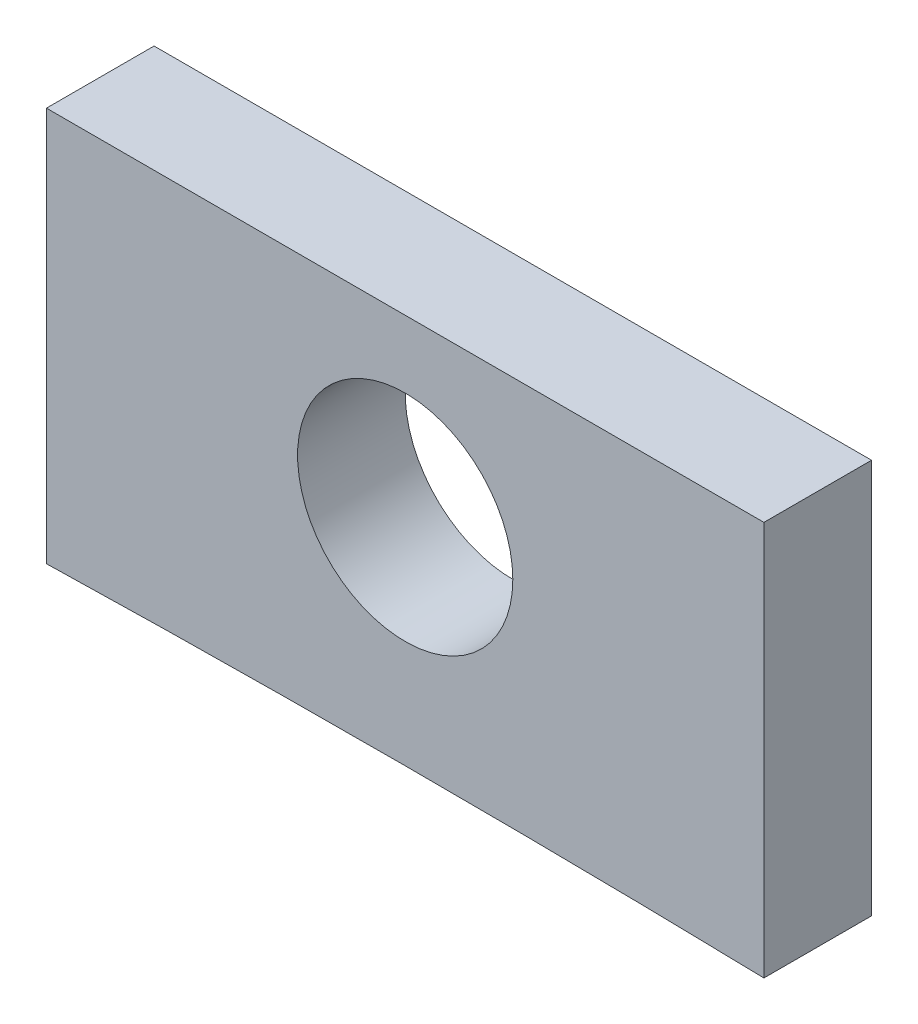
ISO-10303-21;
HEADER;
FILE_DESCRIPTION(('STEP AP214'),'2;1');
FILE_NAME('part.step','',(''),(''),'','','');
FILE_SCHEMA(('AUTOMOTIVE_DESIGN { 1 0 10303 214 1 1 1 1 }'));
ENDSEC;
DATA;
#1=APPLICATION_CONTEXT('core data for automotive mechanical design processes');
#2=APPLICATION_PROTOCOL_DEFINITION('international standard','automotive_design',2000,#1);
#3=PRODUCT_CONTEXT('',#1,'mechanical');
#4=PRODUCT('Part','Part','',(#3));
#5=PRODUCT_RELATED_PRODUCT_CATEGORY('part','',(#4));
#6=PRODUCT_DEFINITION_FORMATION('','',#4);
#7=PRODUCT_DEFINITION_CONTEXT('part definition',#1,'design');
#8=PRODUCT_DEFINITION('design','',#6,#7);
#9=PRODUCT_DEFINITION_SHAPE('','',#8);
#10=(LENGTH_UNIT() NAMED_UNIT(*) SI_UNIT(.MILLI.,.METRE.));
#11=(NAMED_UNIT(*) PLANE_ANGLE_UNIT() SI_UNIT($,.RADIAN.));
#12=(NAMED_UNIT(*) SI_UNIT($,.STERADIAN.) SOLID_ANGLE_UNIT());
#13=UNCERTAINTY_MEASURE_WITH_UNIT(LENGTH_MEASURE(1.E-05),#10,'distance_accuracy_value','');
#14=(GEOMETRIC_REPRESENTATION_CONTEXT(3) GLOBAL_UNCERTAINTY_ASSIGNED_CONTEXT((#13)) GLOBAL_UNIT_ASSIGNED_CONTEXT((#10,
#11,#12)) REPRESENTATION_CONTEXT('',''));
#15=CARTESIAN_POINT('',(0.,0.,0.));
#16=DIRECTION('',(0.,0.,1.));
#17=DIRECTION('',(1.,0.,0.));
#18=AXIS2_PLACEMENT_3D('',#15,#16,#17);
#19=CARTESIAN_POINT('',(0.,283.,3.));
#20=DIRECTION('',(0.,0.,-1.));
#21=DIRECTION('',(-1.,0.,0.));
#22=AXIS2_PLACEMENT_3D('',#19,#20,#21);
#23=PLANE('',#22);
#24=DIRECTION('',(0.,-1.,0.));
#25=VECTOR('',#24,1.);
#26=CARTESIAN_POINT('',(-10.,699.876828606906,3.));
#27=LINE('',#26,#25);
#28=CARTESIAN_POINT('',(-10.,699.876828606906,3.));
#29=VERTEX_POINT('',#28);
#30=CARTESIAN_POINT('',(-10.,688.876828606906,3.));
#31=VERTEX_POINT('',#30);
#32=EDGE_CURVE('E85',#29,#31,#27,.T.);
#33=ORIENTED_EDGE('',*,*,#32,.T.);
#34=CARTESIAN_POINT('',(0.,283.,3.));
#35=DIRECTION('',(0.,0.,-1.));
#36=DIRECTION('',(-1.,0.,0.));
#37=AXIS2_PLACEMENT_3D('',#34,#35,#36);
#38=CIRCLE('',#37,406.);
#39=CARTESIAN_POINT('',(10.,688.876828606906,3.));
#40=VERTEX_POINT('',#39);
#41=EDGE_CURVE('E80',#31,#40,#38,.T.);
#42=ORIENTED_EDGE('',*,*,#41,.T.);
#43=DIRECTION('',(0.,1.,0.));
#44=VECTOR('',#43,1.);
#45=CARTESIAN_POINT('',(10.,699.876828606906,3.));
#46=LINE('',#45,#44);
#47=CARTESIAN_POINT('',(10.,699.876828606906,3.));
#48=VERTEX_POINT('',#47);
#49=EDGE_CURVE('E83',#40,#48,#46,.T.);
#50=ORIENTED_EDGE('',*,*,#49,.T.);
#51=DIRECTION('',(-1.,0.,0.));
#52=VECTOR('',#51,1.);
#53=CARTESIAN_POINT('',(-10.,699.876828606906,3.));
#54=LINE('',#53,#52);
#55=EDGE_CURVE('E50',#48,#29,#54,.T.);
#56=ORIENTED_EDGE('',*,*,#55,.T.);
#57=EDGE_LOOP('',(#33,#42,#50,#56));
#58=FACE_BOUND('',#57,.T.);
#59=CARTESIAN_POINT('',(0.,695.,3.));
#60=DIRECTION('',(0.,0.,1.));
#61=DIRECTION('',(1.,0.,0.));
#62=AXIS2_PLACEMENT_3D('',#59,#60,#61);
#63=CIRCLE('',#62,3.);
#64=CARTESIAN_POINT('',(3.,695.,3.));
#65=VERTEX_POINT('',#64);
#66=EDGE_CURVE('E100',#65,#65,#63,.T.);
#67=ORIENTED_EDGE('',*,*,#66,.F.);
#68=EDGE_LOOP('',(#67));
#69=FACE_BOUND('',#68,.T.);
#70=ADVANCED_FACE('F33',(#58,#69),#23,.F.);
#71=CARTESIAN_POINT('',(0.,283.,0.));
#72=DIRECTION('',(0.,0.,-1.));
#73=DIRECTION('',(-1.,0.,0.));
#74=AXIS2_PLACEMENT_3D('',#71,#72,#73);
#75=PLANE('',#74);
#76=DIRECTION('',(0.,-1.,0.));
#77=VECTOR('',#76,1.);
#78=CARTESIAN_POINT('',(-10.,699.876828606906,0.));
#79=LINE('',#78,#77);
#80=CARTESIAN_POINT('',(-10.,699.876828606906,0.));
#81=VERTEX_POINT('',#80);
#82=CARTESIAN_POINT('',(-10.,688.876828606906,0.));
#83=VERTEX_POINT('',#82);
#84=EDGE_CURVE('E97',#81,#83,#79,.T.);
#85=ORIENTED_EDGE('',*,*,#84,.F.);
#86=DIRECTION('',(-1.,0.,0.));
#87=VECTOR('',#86,1.);
#88=CARTESIAN_POINT('',(-10.,699.876828606906,0.));
#89=LINE('',#88,#87);
#90=CARTESIAN_POINT('',(10.,699.876828606906,0.));
#91=VERTEX_POINT('',#90);
#92=EDGE_CURVE('E73',#91,#81,#89,.T.);
#93=ORIENTED_EDGE('',*,*,#92,.F.);
#94=DIRECTION('',(0.,1.,0.));
#95=VECTOR('',#94,1.);
#96=CARTESIAN_POINT('',(10.,699.876828606906,0.));
#97=LINE('',#96,#95);
#98=CARTESIAN_POINT('',(10.,688.876828606906,0.));
#99=VERTEX_POINT('',#98);
#100=EDGE_CURVE('E67',#99,#91,#97,.T.);
#101=ORIENTED_EDGE('',*,*,#100,.F.);
#102=CARTESIAN_POINT('',(0.,283.,0.));
#103=DIRECTION('',(0.,0.,-1.));
#104=DIRECTION('',(-1.,0.,0.));
#105=AXIS2_PLACEMENT_3D('',#102,#103,#104);
#106=CIRCLE('',#105,406.);
#107=EDGE_CURVE('E89',#83,#99,#106,.T.);
#108=ORIENTED_EDGE('',*,*,#107,.F.);
#109=EDGE_LOOP('',(#85,#93,#101,#108));
#110=FACE_BOUND('',#109,.T.);
#111=CARTESIAN_POINT('',(0.,695.,0.));
#112=DIRECTION('',(0.,0.,1.));
#113=DIRECTION('',(1.,0.,0.));
#114=AXIS2_PLACEMENT_3D('',#111,#112,#113);
#115=CIRCLE('',#114,3.);
#116=CARTESIAN_POINT('',(3.,695.,0.));
#117=VERTEX_POINT('',#116);
#118=EDGE_CURVE('E112',#117,#117,#115,.T.);
#119=ORIENTED_EDGE('',*,*,#118,.T.);
#120=EDGE_LOOP('',(#119));
#121=FACE_BOUND('',#120,.T.);
#122=ADVANCED_FACE('F108',(#110,#121),#75,.T.);
#123=CARTESIAN_POINT('',(-10.,699.876828606906,3.));
#124=DIRECTION('',(1.,0.,0.));
#125=DIRECTION('',(0.,1.,0.));
#126=AXIS2_PLACEMENT_3D('',#123,#124,#125);
#127=PLANE('',#126);
#128=ORIENTED_EDGE('',*,*,#84,.T.);
#129=DIRECTION('',(0.,0.,-1.));
#130=VECTOR('',#129,1.);
#131=CARTESIAN_POINT('',(-10.,688.876828606906,3.));
#132=LINE('',#131,#130);
#133=EDGE_CURVE('E11',#31,#83,#132,.T.);
#134=ORIENTED_EDGE('',*,*,#133,.F.);
#135=ORIENTED_EDGE('',*,*,#32,.F.);
#136=DIRECTION('',(0.,0.,-1.));
#137=VECTOR('',#136,1.);
#138=CARTESIAN_POINT('',(-10.,699.876828606906,3.));
#139=LINE('',#138,#137);
#140=EDGE_CURVE('E93',#29,#81,#139,.T.);
#141=ORIENTED_EDGE('',*,*,#140,.T.);
#142=EDGE_LOOP('',(#128,#134,#135,#141));
#143=FACE_BOUND('',#142,.T.);
#144=ADVANCED_FACE('F35',(#143),#127,.F.);
#145=CARTESIAN_POINT('',(0.,283.,3.));
#146=DIRECTION('',(0.,0.,-1.));
#147=DIRECTION('',(-1.,0.,0.));
#148=AXIS2_PLACEMENT_3D('',#145,#146,#147);
#149=CYLINDRICAL_SURFACE('',#148,406.);
#150=ORIENTED_EDGE('',*,*,#107,.T.);
#151=DIRECTION('',(0.,0.,-1.));
#152=VECTOR('',#151,1.);
#153=CARTESIAN_POINT('',(10.,688.876828606906,3.));
#154=LINE('',#153,#152);
#155=EDGE_CURVE('E42',#40,#99,#154,.T.);
#156=ORIENTED_EDGE('',*,*,#155,.F.);
#157=ORIENTED_EDGE('',*,*,#41,.F.);
#158=ORIENTED_EDGE('',*,*,#133,.T.);
#159=EDGE_LOOP('',(#150,#156,#157,#158));
#160=FACE_BOUND('',#159,.T.);
#161=ADVANCED_FACE('F88',(#160),#149,.F.);
#162=CARTESIAN_POINT('',(10.,699.876828606906,3.));
#163=DIRECTION('',(-1.,0.,0.));
#164=DIRECTION('',(0.,-1.,0.));
#165=AXIS2_PLACEMENT_3D('',#162,#163,#164);
#166=PLANE('',#165);
#167=ORIENTED_EDGE('',*,*,#100,.T.);
#168=DIRECTION('',(0.,0.,-1.));
#169=VECTOR('',#168,1.);
#170=CARTESIAN_POINT('',(10.,699.876828606906,3.));
#171=LINE('',#170,#169);
#172=EDGE_CURVE('E90',#48,#91,#171,.T.);
#173=ORIENTED_EDGE('',*,*,#172,.F.);
#174=ORIENTED_EDGE('',*,*,#49,.F.);
#175=ORIENTED_EDGE('',*,*,#155,.T.);
#176=EDGE_LOOP('',(#167,#173,#174,#175));
#177=FACE_BOUND('',#176,.T.);
#178=ADVANCED_FACE('F91',(#177),#166,.F.);
#179=CARTESIAN_POINT('',(-10.,699.876828606906,3.));
#180=DIRECTION('',(0.,-1.,0.));
#181=DIRECTION('',(0.,0.,-1.));
#182=AXIS2_PLACEMENT_3D('',#179,#180,#181);
#183=PLANE('',#182);
#184=ORIENTED_EDGE('',*,*,#92,.T.);
#185=ORIENTED_EDGE('',*,*,#140,.F.);
#186=ORIENTED_EDGE('',*,*,#55,.F.);
#187=ORIENTED_EDGE('',*,*,#172,.T.);
#188=EDGE_LOOP('',(#184,#185,#186,#187));
#189=FACE_BOUND('',#188,.T.);
#190=ADVANCED_FACE('F105',(#189),#183,.F.);
#191=CARTESIAN_POINT('',(0.,695.,3.));
#192=DIRECTION('',(0.,0.,-1.));
#193=DIRECTION('',(-1.,0.,0.));
#194=AXIS2_PLACEMENT_3D('',#191,#192,#193);
#195=CYLINDRICAL_SURFACE('',#194,3.);
#196=ORIENTED_EDGE('',*,*,#66,.T.);
#197=EDGE_LOOP('',(#196));
#198=FACE_BOUND('',#197,.T.);
#199=ORIENTED_EDGE('',*,*,#118,.F.);
#200=EDGE_LOOP('',(#199));
#201=FACE_BOUND('',#200,.T.);
#202=ADVANCED_FACE('F118',(#198,#201),#195,.F.);
#203=CLOSED_SHELL('',(#70,#122,#144,#161,#178,#190,#202));
#204=MANIFOLD_SOLID_BREP('B2',#203);
#205=ADVANCED_BREP_SHAPE_REPRESENTATION('',(#18,#204),#14);
#206=SHAPE_DEFINITION_REPRESENTATION(#9,#205);
ENDSEC;
END-ISO-10303-21;
